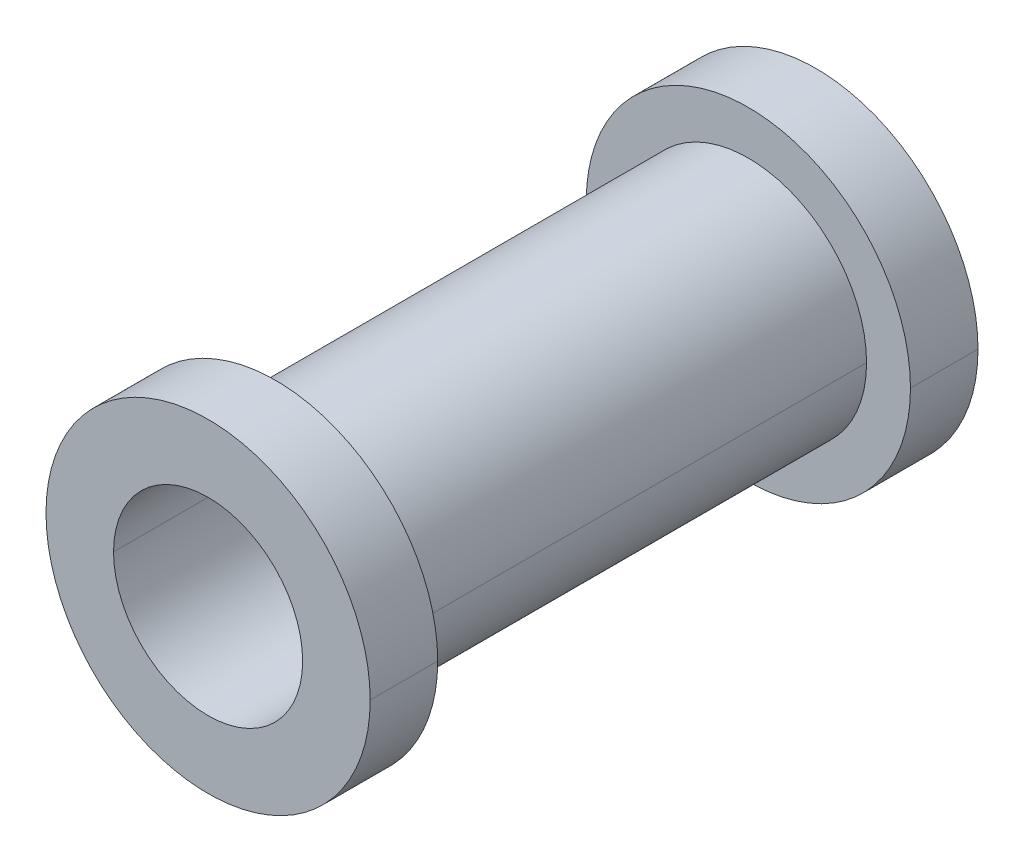
ISO-10303-21;
HEADER;
FILE_DESCRIPTION(('STEP AP214'),'2;1');
FILE_NAME('part.step','',(''),(''),'','','');
FILE_SCHEMA(('AUTOMOTIVE_DESIGN { 1 0 10303 214 1 1 1 1 }'));
ENDSEC;
DATA;
#1=APPLICATION_CONTEXT('core data for automotive mechanical design processes');
#2=APPLICATION_PROTOCOL_DEFINITION('international standard','automotive_design',2000,#1);
#3=PRODUCT_CONTEXT('',#1,'mechanical');
#4=PRODUCT('Part','Part','',(#3));
#5=PRODUCT_RELATED_PRODUCT_CATEGORY('part','',(#4));
#6=PRODUCT_DEFINITION_FORMATION('','',#4);
#7=PRODUCT_DEFINITION_CONTEXT('part definition',#1,'design');
#8=PRODUCT_DEFINITION('design','',#6,#7);
#9=PRODUCT_DEFINITION_SHAPE('','',#8);
#10=(LENGTH_UNIT() NAMED_UNIT(*) SI_UNIT(.MILLI.,.METRE.));
#11=(NAMED_UNIT(*) PLANE_ANGLE_UNIT() SI_UNIT($,.RADIAN.));
#12=(NAMED_UNIT(*) SI_UNIT($,.STERADIAN.) SOLID_ANGLE_UNIT());
#13=UNCERTAINTY_MEASURE_WITH_UNIT(LENGTH_MEASURE(1.E-05),#10,'distance_accuracy_value','');
#14=(GEOMETRIC_REPRESENTATION_CONTEXT(3) GLOBAL_UNCERTAINTY_ASSIGNED_CONTEXT((#13)) GLOBAL_UNIT_ASSIGNED_CONTEXT((#10,
#11,#12)) REPRESENTATION_CONTEXT('',''));
#15=CARTESIAN_POINT('',(0.,0.,0.));
#16=DIRECTION('',(0.,0.,1.));
#17=DIRECTION('',(1.,0.,0.));
#18=AXIS2_PLACEMENT_3D('',#15,#16,#17);
#19=CARTESIAN_POINT('',(0.,0.,-8.));
#20=DIRECTION('',(0.,0.,1.));
#21=DIRECTION('',(1.,0.,0.));
#22=AXIS2_PLACEMENT_3D('',#19,#20,#21);
#23=CYLINDRICAL_SURFACE('',#22,1.75);
#24=DIRECTION('',(0.,0.,1.));
#25=VECTOR('',#24,1.);
#26=CARTESIAN_POINT('',(1.75,0.,-8.));
#27=LINE('',#26,#25);
#28=CARTESIAN_POINT('',(1.75,0.,-8.));
#29=VERTEX_POINT('',#28);
#30=CARTESIAN_POINT('',(1.75,0.,-1.));
#31=VERTEX_POINT('',#30);
#32=EDGE_CURVE('E91',#29,#31,#27,.T.);
#33=ORIENTED_EDGE('',*,*,#32,.F.);
#34=CARTESIAN_POINT('',(0.,0.,-8.));
#35=DIRECTION('',(0.,0.,1.));
#36=DIRECTION('',(1.,0.,0.));
#37=AXIS2_PLACEMENT_3D('',#34,#35,#36);
#38=CIRCLE('',#37,1.75);
#39=CARTESIAN_POINT('',(-1.75,0.,-8.));
#40=VERTEX_POINT('',#39);
#41=EDGE_CURVE('E20',#29,#40,#38,.T.);
#42=ORIENTED_EDGE('',*,*,#41,.T.);
#43=DIRECTION('',(0.,0.,1.));
#44=VECTOR('',#43,1.);
#45=CARTESIAN_POINT('',(-1.75,0.,-8.));
#46=LINE('',#45,#44);
#47=CARTESIAN_POINT('',(-1.75,0.,-1.));
#48=VERTEX_POINT('',#47);
#49=EDGE_CURVE('E84',#48,#40,#46,.F.);
#50=ORIENTED_EDGE('',*,*,#49,.F.);
#51=CARTESIAN_POINT('',(0.,0.,-1.));
#52=DIRECTION('',(0.,0.,1.));
#53=DIRECTION('',(1.,0.,0.));
#54=AXIS2_PLACEMENT_3D('',#51,#52,#53);
#55=CIRCLE('',#54,1.75);
#56=EDGE_CURVE('E95',#48,#31,#55,.F.);
#57=ORIENTED_EDGE('',*,*,#56,.T.);
#58=EDGE_LOOP('',(#33,#42,#50,#57));
#59=FACE_BOUND('',#58,.T.);
#60=ADVANCED_FACE('F17',(#59),#23,.T.);
#61=CARTESIAN_POINT('',(0.,0.,-8.));
#62=DIRECTION('',(0.,0.,1.));
#63=DIRECTION('',(1.,0.,0.));
#64=AXIS2_PLACEMENT_3D('',#61,#62,#63);
#65=CYLINDRICAL_SURFACE('',#64,1.75);
#66=ORIENTED_EDGE('',*,*,#49,.T.);
#67=CARTESIAN_POINT('',(0.,0.,-8.));
#68=DIRECTION('',(0.,0.,1.));
#69=DIRECTION('',(1.,0.,0.));
#70=AXIS2_PLACEMENT_3D('',#67,#68,#69);
#71=CIRCLE('',#70,1.75);
#72=EDGE_CURVE('E86',#40,#29,#71,.T.);
#73=ORIENTED_EDGE('',*,*,#72,.T.);
#74=ORIENTED_EDGE('',*,*,#32,.T.);
#75=CARTESIAN_POINT('',(0.,0.,-1.));
#76=DIRECTION('',(0.,0.,1.));
#77=DIRECTION('',(1.,0.,0.));
#78=AXIS2_PLACEMENT_3D('',#75,#76,#77);
#79=CIRCLE('',#78,1.75);
#80=EDGE_CURVE('E88',#31,#48,#79,.F.);
#81=ORIENTED_EDGE('',*,*,#80,.T.);
#82=EDGE_LOOP('',(#66,#73,#74,#81));
#83=FACE_BOUND('',#82,.T.);
#84=ADVANCED_FACE('F85',(#83),#65,.T.);
#85=CARTESIAN_POINT('',(0.,0.,-8.));
#86=DIRECTION('',(0.,0.,-1.));
#87=DIRECTION('',(-1.,0.,0.));
#88=AXIS2_PLACEMENT_3D('',#85,#86,#87);
#89=PLANE('',#88);
#90=ORIENTED_EDGE('',*,*,#41,.F.);
#91=ORIENTED_EDGE('',*,*,#72,.F.);
#92=EDGE_LOOP('',(#90,#91));
#93=FACE_BOUND('',#92,.T.);
#94=CARTESIAN_POINT('',(0.,0.,-8.));
#95=DIRECTION('',(0.,0.,1.));
#96=DIRECTION('',(1.,0.,0.));
#97=AXIS2_PLACEMENT_3D('',#94,#95,#96);
#98=CIRCLE('',#97,2.4);
#99=CARTESIAN_POINT('',(2.4,0.,-8.));
#100=VERTEX_POINT('',#99);
#101=CARTESIAN_POINT('',(-2.4,0.,-8.));
#102=VERTEX_POINT('',#101);
#103=EDGE_CURVE('E131',#100,#102,#98,.F.);
#104=ORIENTED_EDGE('',*,*,#103,.F.);
#105=CARTESIAN_POINT('',(0.,0.,-8.));
#106=DIRECTION('',(0.,0.,1.));
#107=DIRECTION('',(1.,0.,0.));
#108=AXIS2_PLACEMENT_3D('',#105,#106,#107);
#109=CIRCLE('',#108,2.4);
#110=EDGE_CURVE('E129',#102,#100,#109,.F.);
#111=ORIENTED_EDGE('',*,*,#110,.F.);
#112=EDGE_LOOP('',(#104,#111));
#113=FACE_BOUND('',#112,.T.);
#114=ADVANCED_FACE('F93',(#93,#113),#89,.F.);
#115=CARTESIAN_POINT('',(0.,0.,-1.));
#116=DIRECTION('',(0.,0.,1.));
#117=DIRECTION('',(1.,0.,0.));
#118=AXIS2_PLACEMENT_3D('',#115,#116,#117);
#119=PLANE('',#118);
#120=ORIENTED_EDGE('',*,*,#56,.F.);
#121=ORIENTED_EDGE('',*,*,#80,.F.);
#122=EDGE_LOOP('',(#120,#121));
#123=FACE_BOUND('',#122,.T.);
#124=CARTESIAN_POINT('',(0.,0.,-1.));
#125=DIRECTION('',(0.,0.,1.));
#126=DIRECTION('',(1.,0.,0.));
#127=AXIS2_PLACEMENT_3D('',#124,#125,#126);
#128=CIRCLE('',#127,2.4);
#129=CARTESIAN_POINT('',(-2.4,0.,-1.));
#130=VERTEX_POINT('',#129);
#131=CARTESIAN_POINT('',(2.4,0.,-1.));
#132=VERTEX_POINT('',#131);
#133=EDGE_CURVE('E125',#130,#132,#128,.T.);
#134=ORIENTED_EDGE('',*,*,#133,.F.);
#135=CARTESIAN_POINT('',(0.,0.,-1.));
#136=DIRECTION('',(0.,0.,1.));
#137=DIRECTION('',(1.,0.,0.));
#138=AXIS2_PLACEMENT_3D('',#135,#136,#137);
#139=CIRCLE('',#138,2.4);
#140=EDGE_CURVE('E121',#132,#130,#139,.T.);
#141=ORIENTED_EDGE('',*,*,#140,.F.);
#142=EDGE_LOOP('',(#134,#141));
#143=FACE_BOUND('',#142,.T.);
#144=ADVANCED_FACE('F172',(#123,#143),#119,.F.);
#145=CARTESIAN_POINT('',(0.,0.,-9.));
#146=DIRECTION('',(0.,0.,1.));
#147=DIRECTION('',(1.,0.,0.));
#148=AXIS2_PLACEMENT_3D('',#145,#146,#147);
#149=CYLINDRICAL_SURFACE('',#148,2.4);
#150=DIRECTION('',(0.,0.,1.));
#151=VECTOR('',#150,1.);
#152=CARTESIAN_POINT('',(-2.4,0.,-9.));
#153=LINE('',#152,#151);
#154=CARTESIAN_POINT('',(-2.4,0.,-9.));
#155=VERTEX_POINT('',#154);
#156=EDGE_CURVE('E98',#155,#102,#153,.T.);
#157=ORIENTED_EDGE('',*,*,#156,.F.);
#158=CARTESIAN_POINT('',(0.,0.,-9.));
#159=DIRECTION('',(0.,0.,1.));
#160=DIRECTION('',(1.,0.,0.));
#161=AXIS2_PLACEMENT_3D('',#158,#159,#160);
#162=CIRCLE('',#161,2.4);
#163=CARTESIAN_POINT('',(2.4,0.,-9.));
#164=VERTEX_POINT('',#163);
#165=EDGE_CURVE('E119',#164,#155,#162,.F.);
#166=ORIENTED_EDGE('',*,*,#165,.F.);
#167=DIRECTION('',(0.,0.,1.));
#168=VECTOR('',#167,1.);
#169=CARTESIAN_POINT('',(2.4,0.,-9.));
#170=LINE('',#169,#168);
#171=EDGE_CURVE('E128',#100,#164,#170,.F.);
#172=ORIENTED_EDGE('',*,*,#171,.F.);
#173=ORIENTED_EDGE('',*,*,#103,.T.);
#174=EDGE_LOOP('',(#157,#166,#172,#173));
#175=FACE_BOUND('',#174,.T.);
#176=ADVANCED_FACE('F144',(#175),#149,.T.);
#177=CARTESIAN_POINT('',(0.,0.,-9.));
#178=DIRECTION('',(0.,0.,1.));
#179=DIRECTION('',(1.,0.,0.));
#180=AXIS2_PLACEMENT_3D('',#177,#178,#179);
#181=CYLINDRICAL_SURFACE('',#180,2.4);
#182=ORIENTED_EDGE('',*,*,#171,.T.);
#183=CARTESIAN_POINT('',(0.,0.,-9.));
#184=DIRECTION('',(0.,0.,1.));
#185=DIRECTION('',(1.,0.,0.));
#186=AXIS2_PLACEMENT_3D('',#183,#184,#185);
#187=CIRCLE('',#186,2.4);
#188=EDGE_CURVE('E116',#155,#164,#187,.F.);
#189=ORIENTED_EDGE('',*,*,#188,.F.);
#190=ORIENTED_EDGE('',*,*,#156,.T.);
#191=ORIENTED_EDGE('',*,*,#110,.T.);
#192=EDGE_LOOP('',(#182,#189,#190,#191));
#193=FACE_BOUND('',#192,.T.);
#194=ADVANCED_FACE('F142',(#193),#181,.T.);
#195=CARTESIAN_POINT('',(0.,0.,-1.));
#196=DIRECTION('',(0.,0.,1.));
#197=DIRECTION('',(1.,0.,0.));
#198=AXIS2_PLACEMENT_3D('',#195,#196,#197);
#199=CYLINDRICAL_SURFACE('',#198,2.4);
#200=DIRECTION('',(0.,0.,1.));
#201=VECTOR('',#200,1.);
#202=CARTESIAN_POINT('',(-2.4,0.,-1.));
#203=LINE('',#202,#201);
#204=CARTESIAN_POINT('',(-2.4,0.,0.));
#205=VERTEX_POINT('',#204);
#206=EDGE_CURVE('E127',#130,#205,#203,.T.);
#207=ORIENTED_EDGE('',*,*,#206,.F.);
#208=ORIENTED_EDGE('',*,*,#133,.T.);
#209=DIRECTION('',(0.,0.,1.));
#210=VECTOR('',#209,1.);
#211=CARTESIAN_POINT('',(2.4,0.,-1.));
#212=LINE('',#211,#210);
#213=CARTESIAN_POINT('',(2.4,0.,0.));
#214=VERTEX_POINT('',#213);
#215=EDGE_CURVE('E124',#214,#132,#212,.F.);
#216=ORIENTED_EDGE('',*,*,#215,.F.);
#217=CARTESIAN_POINT('',(0.,0.,0.));
#218=DIRECTION('',(0.,0.,1.));
#219=DIRECTION('',(1.,0.,0.));
#220=AXIS2_PLACEMENT_3D('',#217,#218,#219);
#221=CIRCLE('',#220,2.4);
#222=EDGE_CURVE('E114',#205,#214,#221,.T.);
#223=ORIENTED_EDGE('',*,*,#222,.F.);
#224=EDGE_LOOP('',(#207,#208,#216,#223));
#225=FACE_BOUND('',#224,.T.);
#226=ADVANCED_FACE('F167',(#225),#199,.T.);
#227=CARTESIAN_POINT('',(0.,0.,-1.));
#228=DIRECTION('',(0.,0.,1.));
#229=DIRECTION('',(1.,0.,0.));
#230=AXIS2_PLACEMENT_3D('',#227,#228,#229);
#231=CYLINDRICAL_SURFACE('',#230,2.4);
#232=ORIENTED_EDGE('',*,*,#215,.T.);
#233=ORIENTED_EDGE('',*,*,#140,.T.);
#234=ORIENTED_EDGE('',*,*,#206,.T.);
#235=CARTESIAN_POINT('',(0.,0.,0.));
#236=DIRECTION('',(0.,0.,1.));
#237=DIRECTION('',(1.,0.,0.));
#238=AXIS2_PLACEMENT_3D('',#235,#236,#237);
#239=CIRCLE('',#238,2.4);
#240=EDGE_CURVE('E111',#214,#205,#239,.T.);
#241=ORIENTED_EDGE('',*,*,#240,.F.);
#242=EDGE_LOOP('',(#232,#233,#234,#241));
#243=FACE_BOUND('',#242,.T.);
#244=ADVANCED_FACE('F170',(#243),#231,.T.);
#245=CARTESIAN_POINT('',(0.,0.,-9.));
#246=DIRECTION('',(0.,0.,-1.));
#247=DIRECTION('',(-1.,0.,0.));
#248=AXIS2_PLACEMENT_3D('',#245,#246,#247);
#249=PLANE('',#248);
#250=CARTESIAN_POINT('',(0.,0.,-9.));
#251=DIRECTION('',(0.,0.,1.));
#252=DIRECTION('',(1.,0.,0.));
#253=AXIS2_PLACEMENT_3D('',#250,#251,#252);
#254=CIRCLE('',#253,1.4);
#255=CARTESIAN_POINT('',(-1.4,0.,-9.));
#256=VERTEX_POINT('',#255);
#257=CARTESIAN_POINT('',(1.4,0.,-9.));
#258=VERTEX_POINT('',#257);
#259=EDGE_CURVE('E104',#256,#258,#254,.T.);
#260=ORIENTED_EDGE('',*,*,#259,.T.);
#261=CARTESIAN_POINT('',(0.,0.,-9.));
#262=DIRECTION('',(0.,0.,1.));
#263=DIRECTION('',(1.,0.,0.));
#264=AXIS2_PLACEMENT_3D('',#261,#262,#263);
#265=CIRCLE('',#264,1.4);
#266=EDGE_CURVE('E108',#258,#256,#265,.T.);
#267=ORIENTED_EDGE('',*,*,#266,.T.);
#268=EDGE_LOOP('',(#260,#267));
#269=FACE_BOUND('',#268,.T.);
#270=ORIENTED_EDGE('',*,*,#165,.T.);
#271=ORIENTED_EDGE('',*,*,#188,.T.);
#272=EDGE_LOOP('',(#270,#271));
#273=FACE_BOUND('',#272,.T.);
#274=ADVANCED_FACE('F155',(#269,#273),#249,.T.);
#275=CARTESIAN_POINT('',(0.,0.,0.));
#276=DIRECTION('',(0.,0.,1.));
#277=DIRECTION('',(1.,0.,0.));
#278=AXIS2_PLACEMENT_3D('',#275,#276,#277);
#279=PLANE('',#278);
#280=CARTESIAN_POINT('',(0.,0.,0.));
#281=DIRECTION('',(0.,0.,1.));
#282=DIRECTION('',(1.,0.,0.));
#283=AXIS2_PLACEMENT_3D('',#280,#281,#282);
#284=CIRCLE('',#283,1.4);
#285=CARTESIAN_POINT('',(-1.4,0.,0.));
#286=VERTEX_POINT('',#285);
#287=CARTESIAN_POINT('',(1.4,0.,0.));
#288=VERTEX_POINT('',#287);
#289=EDGE_CURVE('E34',#286,#288,#284,.F.);
#290=ORIENTED_EDGE('',*,*,#289,.T.);
#291=CARTESIAN_POINT('',(0.,0.,0.));
#292=DIRECTION('',(0.,0.,1.));
#293=DIRECTION('',(1.,0.,0.));
#294=AXIS2_PLACEMENT_3D('',#291,#292,#293);
#295=CIRCLE('',#294,1.4);
#296=EDGE_CURVE('E26',#288,#286,#295,.F.);
#297=ORIENTED_EDGE('',*,*,#296,.T.);
#298=EDGE_LOOP('',(#290,#297));
#299=FACE_BOUND('',#298,.T.);
#300=ORIENTED_EDGE('',*,*,#222,.T.);
#301=ORIENTED_EDGE('',*,*,#240,.T.);
#302=EDGE_LOOP('',(#300,#301));
#303=FACE_BOUND('',#302,.T.);
#304=ADVANCED_FACE('F158',(#299,#303),#279,.T.);
#305=CARTESIAN_POINT('',(0.,0.,-9.));
#306=DIRECTION('',(0.,0.,1.));
#307=DIRECTION('',(1.,0.,0.));
#308=AXIS2_PLACEMENT_3D('',#305,#306,#307);
#309=CYLINDRICAL_SURFACE('',#308,1.4);
#310=ORIENTED_EDGE('',*,*,#289,.F.);
#311=DIRECTION('',(0.,0.,1.));
#312=VECTOR('',#311,1.);
#313=CARTESIAN_POINT('',(-1.4,0.,-9.));
#314=LINE('',#313,#312);
#315=EDGE_CURVE('E11',#286,#256,#314,.F.);
#316=ORIENTED_EDGE('',*,*,#315,.T.);
#317=ORIENTED_EDGE('',*,*,#266,.F.);
#318=DIRECTION('',(0.,0.,1.));
#319=VECTOR('',#318,1.);
#320=CARTESIAN_POINT('',(1.4,0.,-9.));
#321=LINE('',#320,#319);
#322=EDGE_CURVE('E103',#258,#288,#321,.T.);
#323=ORIENTED_EDGE('',*,*,#322,.T.);
#324=EDGE_LOOP('',(#310,#316,#317,#323));
#325=FACE_BOUND('',#324,.T.);
#326=ADVANCED_FACE('F150',(#325),#309,.F.);
#327=CARTESIAN_POINT('',(0.,0.,-9.));
#328=DIRECTION('',(0.,0.,1.));
#329=DIRECTION('',(1.,0.,0.));
#330=AXIS2_PLACEMENT_3D('',#327,#328,#329);
#331=CYLINDRICAL_SURFACE('',#330,1.4);
#332=ORIENTED_EDGE('',*,*,#296,.F.);
#333=ORIENTED_EDGE('',*,*,#322,.F.);
#334=ORIENTED_EDGE('',*,*,#259,.F.);
#335=ORIENTED_EDGE('',*,*,#315,.F.);
#336=EDGE_LOOP('',(#332,#333,#334,#335));
#337=FACE_BOUND('',#336,.T.);
#338=ADVANCED_FACE('F153',(#337),#331,.F.);
#339=CLOSED_SHELL('',(#60,#84,#114,#144,#176,#194,#226,#244,#274,#304,#326,#338));
#340=MANIFOLD_SOLID_BREP('B1',#339);
#341=ADVANCED_BREP_SHAPE_REPRESENTATION('',(#18,#340),#14);
#342=SHAPE_DEFINITION_REPRESENTATION(#9,#341);
ENDSEC;
END-ISO-10303-21;
